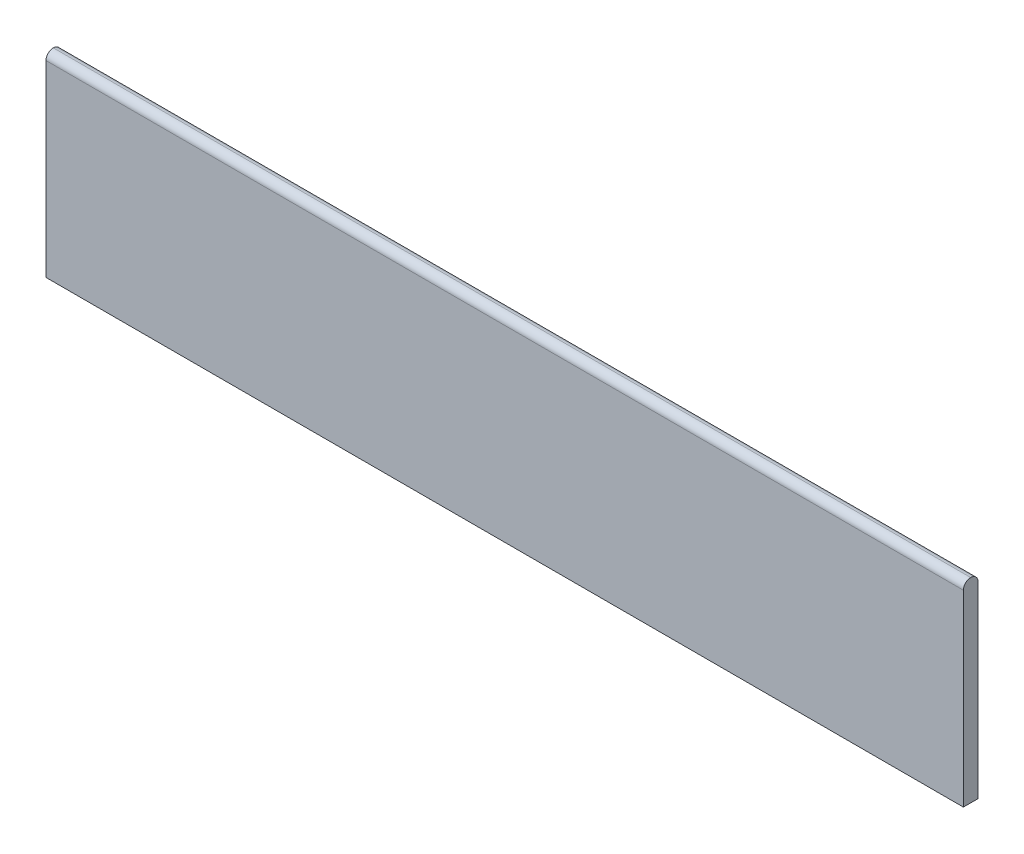
ISO-10303-21;
HEADER;
FILE_DESCRIPTION(('STEP AP214'),'2;1');
FILE_NAME('part.step','',(''),(''),'','','');
FILE_SCHEMA(('AUTOMOTIVE_DESIGN { 1 0 10303 214 1 1 1 1 }'));
ENDSEC;
DATA;
#1=APPLICATION_CONTEXT('core data for automotive mechanical design processes');
#2=APPLICATION_PROTOCOL_DEFINITION('international standard','automotive_design',2000,#1);
#3=PRODUCT_CONTEXT('',#1,'mechanical');
#4=PRODUCT('Part','Part','',(#3));
#5=PRODUCT_RELATED_PRODUCT_CATEGORY('part','',(#4));
#6=PRODUCT_DEFINITION_FORMATION('','',#4);
#7=PRODUCT_DEFINITION_CONTEXT('part definition',#1,'design');
#8=PRODUCT_DEFINITION('design','',#6,#7);
#9=PRODUCT_DEFINITION_SHAPE('','',#8);
#10=(LENGTH_UNIT() NAMED_UNIT(*) SI_UNIT(.MILLI.,.METRE.));
#11=(NAMED_UNIT(*) PLANE_ANGLE_UNIT() SI_UNIT($,.RADIAN.));
#12=(NAMED_UNIT(*) SI_UNIT($,.STERADIAN.) SOLID_ANGLE_UNIT());
#13=UNCERTAINTY_MEASURE_WITH_UNIT(LENGTH_MEASURE(1.E-05),#10,'distance_accuracy_value','');
#14=(GEOMETRIC_REPRESENTATION_CONTEXT(3) GLOBAL_UNCERTAINTY_ASSIGNED_CONTEXT((#13)) GLOBAL_UNIT_ASSIGNED_CONTEXT((#10,
#11,#12)) REPRESENTATION_CONTEXT('',''));
#15=CARTESIAN_POINT('',(0.,0.,0.));
#16=DIRECTION('',(0.,0.,1.));
#17=DIRECTION('',(1.,0.,0.));
#18=AXIS2_PLACEMENT_3D('',#15,#16,#17);
#19=CARTESIAN_POINT('',(0.,0.,3.));
#20=DIRECTION('',(1.,0.,0.));
#21=DIRECTION('',(0.,0.,-1.));
#22=AXIS2_PLACEMENT_3D('',#19,#20,#21);
#23=PLANE('',#22);
#24=CARTESIAN_POINT('',(0.,38.5,1.5));
#25=DIRECTION('',(1.,0.,0.));
#26=DIRECTION('',(0.,0.,-1.));
#27=AXIS2_PLACEMENT_3D('',#24,#25,#26);
#28=CIRCLE('',#27,1.5);
#29=CARTESIAN_POINT('',(0.,38.5,3.));
#30=VERTEX_POINT('',#29);
#31=CARTESIAN_POINT('',(0.,40.,1.5));
#32=VERTEX_POINT('',#31);
#33=EDGE_CURVE('E102',#30,#32,#28,.F.);
#34=ORIENTED_EDGE('',*,*,#33,.T.);
#35=CARTESIAN_POINT('',(0.,38.5,1.5));
#36=DIRECTION('',(1.,0.,0.));
#37=DIRECTION('',(0.,0.,-1.));
#38=AXIS2_PLACEMENT_3D('',#35,#36,#37);
#39=CIRCLE('',#38,1.5);
#40=CARTESIAN_POINT('',(0.,38.5,0.));
#41=VERTEX_POINT('',#40);
#42=EDGE_CURVE('E55',#32,#41,#39,.F.);
#43=ORIENTED_EDGE('',*,*,#42,.T.);
#44=DIRECTION('',(0.,-1.,0.));
#45=VECTOR('',#44,1.);
#46=CARTESIAN_POINT('',(0.,0.,0.));
#47=LINE('',#46,#45);
#48=CARTESIAN_POINT('',(0.,0.,0.));
#49=VERTEX_POINT('',#48);
#50=EDGE_CURVE('E99',#41,#49,#47,.T.);
#51=ORIENTED_EDGE('',*,*,#50,.T.);
#52=DIRECTION('',(0.,0.,-1.));
#53=VECTOR('',#52,1.);
#54=CARTESIAN_POINT('',(0.,0.,3.));
#55=LINE('',#54,#53);
#56=CARTESIAN_POINT('',(0.,0.,3.));
#57=VERTEX_POINT('',#56);
#58=EDGE_CURVE('E93',#57,#49,#55,.T.);
#59=ORIENTED_EDGE('',*,*,#58,.F.);
#60=DIRECTION('',(0.,-1.,0.));
#61=VECTOR('',#60,1.);
#62=CARTESIAN_POINT('',(0.,0.,3.));
#63=LINE('',#62,#61);
#64=EDGE_CURVE('E79',#30,#57,#63,.T.);
#65=ORIENTED_EDGE('',*,*,#64,.F.);
#66=EDGE_LOOP('',(#34,#43,#51,#59,#65));
#67=FACE_BOUND('',#66,.T.);
#68=ADVANCED_FACE('F33',(#67),#23,.F.);
#69=CARTESIAN_POINT('',(0.,0.,3.));
#70=DIRECTION('',(0.,1.,0.));
#71=DIRECTION('',(0.,0.,1.));
#72=AXIS2_PLACEMENT_3D('',#69,#70,#71);
#73=PLANE('',#72);
#74=DIRECTION('',(1.,0.,0.));
#75=VECTOR('',#74,1.);
#76=CARTESIAN_POINT('',(0.,0.,0.));
#77=LINE('',#76,#75);
#78=CARTESIAN_POINT('',(188.,0.,0.));
#79=VERTEX_POINT('',#78);
#80=EDGE_CURVE('E177',#49,#79,#77,.T.);
#81=ORIENTED_EDGE('',*,*,#80,.T.);
#82=DIRECTION('',(0.,0.,-1.));
#83=VECTOR('',#82,1.);
#84=CARTESIAN_POINT('',(188.,0.,3.));
#85=LINE('',#84,#83);
#86=CARTESIAN_POINT('',(188.,0.,3.));
#87=VERTEX_POINT('',#86);
#88=EDGE_CURVE('E95',#87,#79,#85,.T.);
#89=ORIENTED_EDGE('',*,*,#88,.F.);
#90=DIRECTION('',(1.,0.,0.));
#91=VECTOR('',#90,1.);
#92=CARTESIAN_POINT('',(0.,0.,3.));
#93=LINE('',#92,#91);
#94=EDGE_CURVE('E83',#57,#87,#93,.T.);
#95=ORIENTED_EDGE('',*,*,#94,.F.);
#96=ORIENTED_EDGE('',*,*,#58,.T.);
#97=EDGE_LOOP('',(#81,#89,#95,#96));
#98=FACE_BOUND('',#97,.T.);
#99=ADVANCED_FACE('F92',(#98),#73,.F.);
#100=CARTESIAN_POINT('',(188.,0.,3.));
#101=DIRECTION('',(-1.,0.,0.));
#102=DIRECTION('',(0.,0.,1.));
#103=AXIS2_PLACEMENT_3D('',#100,#101,#102);
#104=PLANE('',#103);
#105=DIRECTION('',(0.,1.,0.));
#106=VECTOR('',#105,1.);
#107=CARTESIAN_POINT('',(188.,0.,0.));
#108=LINE('',#107,#106);
#109=CARTESIAN_POINT('',(188.,38.5,0.));
#110=VERTEX_POINT('',#109);
#111=EDGE_CURVE('E88',#79,#110,#108,.T.);
#112=ORIENTED_EDGE('',*,*,#111,.T.);
#113=CARTESIAN_POINT('',(188.,38.5,1.5));
#114=DIRECTION('',(-1.,0.,0.));
#115=DIRECTION('',(0.,0.,1.));
#116=AXIS2_PLACEMENT_3D('',#113,#114,#115);
#117=CIRCLE('',#116,1.5);
#118=CARTESIAN_POINT('',(188.,40.,1.5));
#119=VERTEX_POINT('',#118);
#120=EDGE_CURVE('E11',#110,#119,#117,.F.);
#121=ORIENTED_EDGE('',*,*,#120,.T.);
#122=CARTESIAN_POINT('',(188.,38.5,1.5));
#123=DIRECTION('',(-1.,0.,0.));
#124=DIRECTION('',(0.,0.,1.));
#125=AXIS2_PLACEMENT_3D('',#122,#123,#124);
#126=CIRCLE('',#125,1.5);
#127=CARTESIAN_POINT('',(188.,38.5,3.));
#128=VERTEX_POINT('',#127);
#129=EDGE_CURVE('E111',#119,#128,#126,.F.);
#130=ORIENTED_EDGE('',*,*,#129,.T.);
#131=DIRECTION('',(0.,1.,0.));
#132=VECTOR('',#131,1.);
#133=CARTESIAN_POINT('',(188.,0.,3.));
#134=LINE('',#133,#132);
#135=EDGE_CURVE('E97',#87,#128,#134,.T.);
#136=ORIENTED_EDGE('',*,*,#135,.F.);
#137=ORIENTED_EDGE('',*,*,#88,.T.);
#138=EDGE_LOOP('',(#112,#121,#130,#136,#137));
#139=FACE_BOUND('',#138,.T.);
#140=ADVANCED_FACE('F115',(#139),#104,.F.);
#141=CARTESIAN_POINT('',(0.,0.,3.));
#142=DIRECTION('',(0.,0.,-1.));
#143=DIRECTION('',(-1.,0.,0.));
#144=AXIS2_PLACEMENT_3D('',#141,#142,#143);
#145=PLANE('',#144);
#146=ORIENTED_EDGE('',*,*,#135,.T.);
#147=DIRECTION('',(-1.,0.,0.));
#148=VECTOR('',#147,1.);
#149=CARTESIAN_POINT('',(0.,38.5,3.));
#150=LINE('',#149,#148);
#151=EDGE_CURVE('E86',#128,#30,#150,.T.);
#152=ORIENTED_EDGE('',*,*,#151,.T.);
#153=ORIENTED_EDGE('',*,*,#64,.T.);
#154=ORIENTED_EDGE('',*,*,#94,.T.);
#155=EDGE_LOOP('',(#146,#152,#153,#154));
#156=FACE_BOUND('',#155,.T.);
#157=ADVANCED_FACE('F82',(#156),#145,.F.);
#158=CARTESIAN_POINT('',(0.,0.,0.));
#159=DIRECTION('',(0.,0.,-1.));
#160=DIRECTION('',(-1.,0.,0.));
#161=AXIS2_PLACEMENT_3D('',#158,#159,#160);
#162=PLANE('',#161);
#163=ORIENTED_EDGE('',*,*,#50,.F.);
#164=DIRECTION('',(-1.,0.,0.));
#165=VECTOR('',#164,1.);
#166=CARTESIAN_POINT('',(188.,38.5,0.));
#167=LINE('',#166,#165);
#168=EDGE_CURVE('E41',#41,#110,#167,.F.);
#169=ORIENTED_EDGE('',*,*,#168,.T.);
#170=ORIENTED_EDGE('',*,*,#111,.F.);
#171=ORIENTED_EDGE('',*,*,#80,.F.);
#172=EDGE_LOOP('',(#163,#169,#170,#171));
#173=FACE_BOUND('',#172,.T.);
#174=ADVANCED_FACE('F126',(#173),#162,.T.);
#175=CARTESIAN_POINT('',(0.,38.5,1.5));
#176=DIRECTION('',(-1.,0.,0.));
#177=DIRECTION('',(0.,0.,1.));
#178=AXIS2_PLACEMENT_3D('',#175,#176,#177);
#179=CYLINDRICAL_SURFACE('',#178,1.5);
#180=ORIENTED_EDGE('',*,*,#129,.F.);
#181=DIRECTION('',(-1.,0.,0.));
#182=VECTOR('',#181,1.);
#183=CARTESIAN_POINT('',(0.,40.,1.5));
#184=LINE('',#183,#182);
#185=EDGE_CURVE('E108',#32,#119,#184,.F.);
#186=ORIENTED_EDGE('',*,*,#185,.F.);
#187=ORIENTED_EDGE('',*,*,#33,.F.);
#188=ORIENTED_EDGE('',*,*,#151,.F.);
#189=EDGE_LOOP('',(#180,#186,#187,#188));
#190=FACE_BOUND('',#189,.T.);
#191=ADVANCED_FACE('F120',(#190),#179,.T.);
#192=CARTESIAN_POINT('',(0.,38.5,1.5));
#193=DIRECTION('',(1.,0.,0.));
#194=DIRECTION('',(0.,0.,-1.));
#195=AXIS2_PLACEMENT_3D('',#192,#193,#194);
#196=CYLINDRICAL_SURFACE('',#195,1.5);
#197=ORIENTED_EDGE('',*,*,#120,.F.);
#198=ORIENTED_EDGE('',*,*,#168,.F.);
#199=ORIENTED_EDGE('',*,*,#42,.F.);
#200=ORIENTED_EDGE('',*,*,#185,.T.);
#201=EDGE_LOOP('',(#197,#198,#199,#200));
#202=FACE_BOUND('',#201,.T.);
#203=ADVANCED_FACE('F35',(#202),#196,.T.);
#204=CLOSED_SHELL('',(#68,#99,#140,#157,#174,#191,#203));
#205=MANIFOLD_SOLID_BREP('B2',#204);
#206=ADVANCED_BREP_SHAPE_REPRESENTATION('',(#18,#205),#14);
#207=SHAPE_DEFINITION_REPRESENTATION(#9,#206);
ENDSEC;
END-ISO-10303-21;
